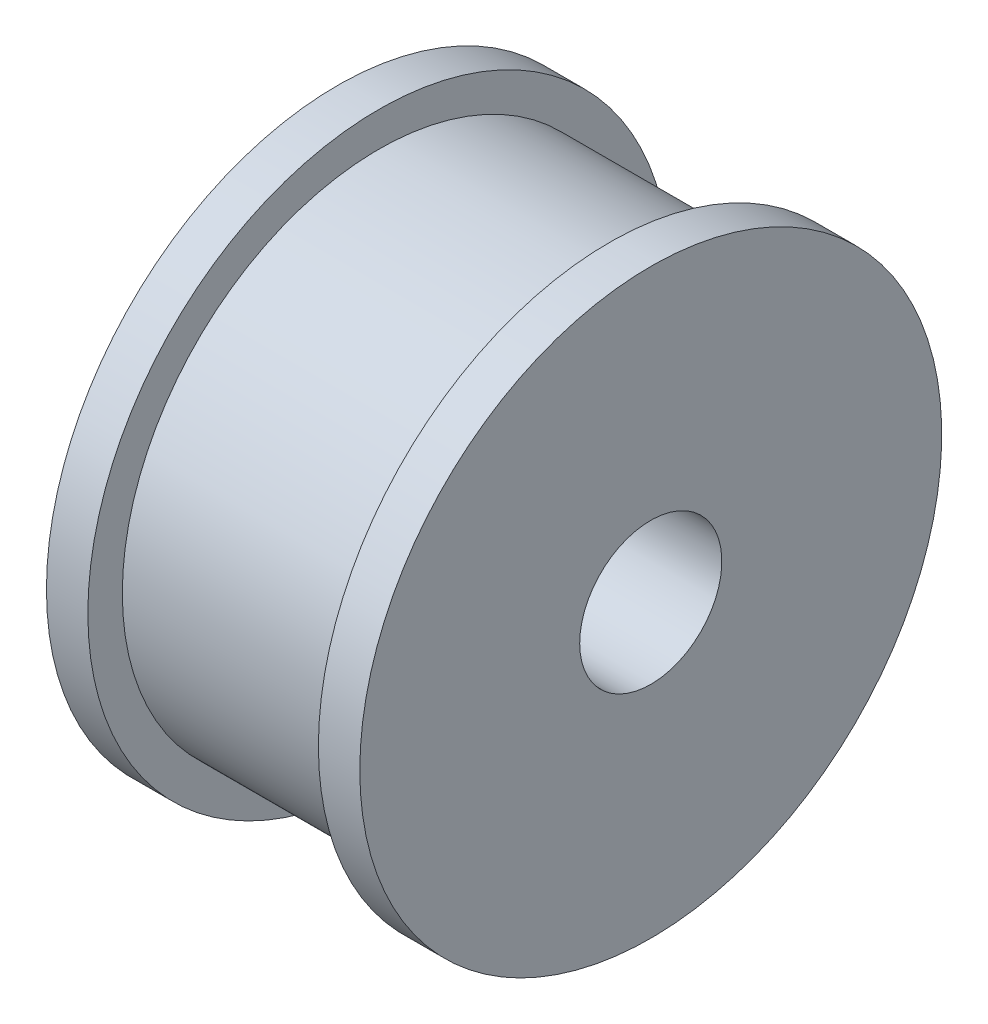
ISO-10303-21;
HEADER;
FILE_DESCRIPTION(('STEP AP214'),'2;1');
FILE_NAME('part.step','',(''),(''),'','','');
FILE_SCHEMA(('AUTOMOTIVE_DESIGN { 1 0 10303 214 1 1 1 1 }'));
ENDSEC;
DATA;
#1=APPLICATION_CONTEXT('core data for automotive mechanical design processes');
#2=APPLICATION_PROTOCOL_DEFINITION('international standard','automotive_design',2000,#1);
#3=PRODUCT_CONTEXT('',#1,'mechanical');
#4=PRODUCT('Part','Part','',(#3));
#5=PRODUCT_RELATED_PRODUCT_CATEGORY('part','',(#4));
#6=PRODUCT_DEFINITION_FORMATION('','',#4);
#7=PRODUCT_DEFINITION_CONTEXT('part definition',#1,'design');
#8=PRODUCT_DEFINITION('design','',#6,#7);
#9=PRODUCT_DEFINITION_SHAPE('','',#8);
#10=(LENGTH_UNIT() NAMED_UNIT(*) SI_UNIT(.MILLI.,.METRE.));
#11=(NAMED_UNIT(*) PLANE_ANGLE_UNIT() SI_UNIT($,.RADIAN.));
#12=(NAMED_UNIT(*) SI_UNIT($,.STERADIAN.) SOLID_ANGLE_UNIT());
#13=UNCERTAINTY_MEASURE_WITH_UNIT(LENGTH_MEASURE(1.E-05),#10,'distance_accuracy_value','');
#14=(GEOMETRIC_REPRESENTATION_CONTEXT(3) GLOBAL_UNCERTAINTY_ASSIGNED_CONTEXT((#13)) GLOBAL_UNIT_ASSIGNED_CONTEXT((#10,
#11,#12)) REPRESENTATION_CONTEXT('',''));
#15=CARTESIAN_POINT('',(0.,0.,0.));
#16=DIRECTION('',(0.,0.,1.));
#17=DIRECTION('',(1.,0.,0.));
#18=AXIS2_PLACEMENT_3D('',#15,#16,#17);
#19=CARTESIAN_POINT('',(-5.15,0.,11.46));
#20=DIRECTION('',(1.,0.,0.));
#21=DIRECTION('',(0.,0.,-1.));
#22=AXIS2_PLACEMENT_3D('',#19,#20,#21);
#23=PLANE('',#22);
#24=CARTESIAN_POINT('',(-5.15,0.,0.));
#25=DIRECTION('',(-1.,0.,0.));
#26=DIRECTION('',(0.,0.,1.));
#27=AXIS2_PLACEMENT_3D('',#24,#25,#26);
#28=CIRCLE('',#27,11.46);
#29=CARTESIAN_POINT('',(-5.15,0.,11.46));
#30=VERTEX_POINT('',#29);
#31=EDGE_CURVE('E53',#30,#30,#28,.T.);
#32=ORIENTED_EDGE('',*,*,#31,.T.);
#33=EDGE_LOOP('',(#32));
#34=FACE_BOUND('',#33,.T.);
#35=CARTESIAN_POINT('',(-5.15,0.,0.));
#36=DIRECTION('',(-1.,0.,0.));
#37=DIRECTION('',(0.,0.,1.));
#38=AXIS2_PLACEMENT_3D('',#35,#36,#37);
#39=CIRCLE('',#38,13.);
#40=CARTESIAN_POINT('',(-5.15,0.,13.));
#41=VERTEX_POINT('',#40);
#42=EDGE_CURVE('E10',#41,#41,#39,.T.);
#43=ORIENTED_EDGE('',*,*,#42,.F.);
#44=EDGE_LOOP('',(#43));
#45=FACE_BOUND('',#44,.T.);
#46=ADVANCED_FACE('F31',(#34,#45),#23,.T.);
#47=CARTESIAN_POINT('',(-7.,0.,0.));
#48=DIRECTION('',(-1.,0.,0.));
#49=DIRECTION('',(0.,0.,1.));
#50=AXIS2_PLACEMENT_3D('',#47,#48,#49);
#51=CYLINDRICAL_SURFACE('',#50,13.);
#52=ORIENTED_EDGE('',*,*,#42,.T.);
#53=EDGE_LOOP('',(#52));
#54=FACE_BOUND('',#53,.T.);
#55=CARTESIAN_POINT('',(-7.,0.,0.));
#56=DIRECTION('',(-1.,0.,0.));
#57=DIRECTION('',(0.,0.,1.));
#58=AXIS2_PLACEMENT_3D('',#55,#56,#57);
#59=CIRCLE('',#58,13.);
#60=CARTESIAN_POINT('',(-7.,0.,13.));
#61=VERTEX_POINT('',#60);
#62=EDGE_CURVE('E37',#61,#61,#59,.T.);
#63=ORIENTED_EDGE('',*,*,#62,.F.);
#64=EDGE_LOOP('',(#63));
#65=FACE_BOUND('',#64,.T.);
#66=ADVANCED_FACE('F68',(#54,#65),#51,.T.);
#67=CARTESIAN_POINT('',(-7.,0.,13.));
#68=DIRECTION('',(-1.,0.,0.));
#69=DIRECTION('',(0.,0.,1.));
#70=AXIS2_PLACEMENT_3D('',#67,#68,#69);
#71=PLANE('',#70);
#72=CARTESIAN_POINT('',(-7.,0.,0.));
#73=DIRECTION('',(-1.,0.,0.));
#74=DIRECTION('',(0.,0.,1.));
#75=AXIS2_PLACEMENT_3D('',#72,#73,#74);
#76=CIRCLE('',#75,3.17499999999999);
#77=CARTESIAN_POINT('',(-7.,0.,3.17499999999999));
#78=VERTEX_POINT('',#77);
#79=EDGE_CURVE('E59',#78,#78,#76,.T.);
#80=ORIENTED_EDGE('',*,*,#79,.F.);
#81=EDGE_LOOP('',(#80));
#82=FACE_BOUND('',#81,.T.);
#83=ORIENTED_EDGE('',*,*,#62,.T.);
#84=EDGE_LOOP('',(#83));
#85=FACE_BOUND('',#84,.T.);
#86=ADVANCED_FACE('F65',(#82,#85),#71,.T.);
#87=CARTESIAN_POINT('',(7.,0.,0.));
#88=DIRECTION('',(1.,0.,0.));
#89=DIRECTION('',(0.,0.,-1.));
#90=AXIS2_PLACEMENT_3D('',#87,#88,#89);
#91=PLANE('',#90);
#92=CARTESIAN_POINT('',(7.,0.,0.));
#93=DIRECTION('',(-1.,0.,0.));
#94=DIRECTION('',(0.,0.,1.));
#95=AXIS2_PLACEMENT_3D('',#92,#93,#94);
#96=CIRCLE('',#95,3.175);
#97=CARTESIAN_POINT('',(7.,0.,3.175));
#98=VERTEX_POINT('',#97);
#99=EDGE_CURVE('E56',#98,#98,#96,.T.);
#100=ORIENTED_EDGE('',*,*,#99,.T.);
#101=EDGE_LOOP('',(#100));
#102=FACE_BOUND('',#101,.T.);
#103=CARTESIAN_POINT('',(7.,0.,0.));
#104=DIRECTION('',(-1.,0.,0.));
#105=DIRECTION('',(0.,0.,1.));
#106=AXIS2_PLACEMENT_3D('',#103,#104,#105);
#107=CIRCLE('',#106,13.);
#108=CARTESIAN_POINT('',(7.,0.,13.));
#109=VERTEX_POINT('',#108);
#110=EDGE_CURVE('E41',#109,#109,#107,.T.);
#111=ORIENTED_EDGE('',*,*,#110,.F.);
#112=EDGE_LOOP('',(#111));
#113=FACE_BOUND('',#112,.T.);
#114=ADVANCED_FACE('F67',(#102,#113),#91,.T.);
#115=CARTESIAN_POINT('',(-7.,0.,0.));
#116=DIRECTION('',(-1.,0.,0.));
#117=DIRECTION('',(0.,0.,1.));
#118=AXIS2_PLACEMENT_3D('',#115,#116,#117);
#119=CYLINDRICAL_SURFACE('',#118,13.);
#120=ORIENTED_EDGE('',*,*,#110,.T.);
#121=EDGE_LOOP('',(#120));
#122=FACE_BOUND('',#121,.T.);
#123=CARTESIAN_POINT('',(5.15,0.,0.));
#124=DIRECTION('',(-1.,0.,0.));
#125=DIRECTION('',(0.,0.,1.));
#126=AXIS2_PLACEMENT_3D('',#123,#124,#125);
#127=CIRCLE('',#126,13.);
#128=CARTESIAN_POINT('',(5.15,0.,13.));
#129=VERTEX_POINT('',#128);
#130=EDGE_CURVE('E45',#129,#129,#127,.T.);
#131=ORIENTED_EDGE('',*,*,#130,.F.);
#132=EDGE_LOOP('',(#131));
#133=FACE_BOUND('',#132,.T.);
#134=ADVANCED_FACE('F74',(#122,#133),#119,.T.);
#135=CARTESIAN_POINT('',(5.15,0.,13.));
#136=DIRECTION('',(-1.,0.,0.));
#137=DIRECTION('',(0.,0.,1.));
#138=AXIS2_PLACEMENT_3D('',#135,#136,#137);
#139=PLANE('',#138);
#140=ORIENTED_EDGE('',*,*,#130,.T.);
#141=EDGE_LOOP('',(#140));
#142=FACE_BOUND('',#141,.T.);
#143=CARTESIAN_POINT('',(5.15,0.,0.));
#144=DIRECTION('',(-1.,0.,0.));
#145=DIRECTION('',(0.,0.,1.));
#146=AXIS2_PLACEMENT_3D('',#143,#144,#145);
#147=CIRCLE('',#146,11.46);
#148=CARTESIAN_POINT('',(5.15,0.,11.46));
#149=VERTEX_POINT('',#148);
#150=EDGE_CURVE('E50',#149,#149,#147,.T.);
#151=ORIENTED_EDGE('',*,*,#150,.F.);
#152=EDGE_LOOP('',(#151));
#153=FACE_BOUND('',#152,.T.);
#154=ADVANCED_FACE('F86',(#142,#153),#139,.T.);
#155=CARTESIAN_POINT('',(-7.,0.,0.));
#156=DIRECTION('',(-1.,0.,0.));
#157=DIRECTION('',(0.,0.,1.));
#158=AXIS2_PLACEMENT_3D('',#155,#156,#157);
#159=CYLINDRICAL_SURFACE('',#158,11.46);
#160=ORIENTED_EDGE('',*,*,#150,.T.);
#161=EDGE_LOOP('',(#160));
#162=FACE_BOUND('',#161,.T.);
#163=ORIENTED_EDGE('',*,*,#31,.F.);
#164=EDGE_LOOP('',(#163));
#165=FACE_BOUND('',#164,.T.);
#166=ADVANCED_FACE('F84',(#162,#165),#159,.T.);
#167=CARTESIAN_POINT('',(-7.,0.,0.));
#168=DIRECTION('',(-1.,0.,0.));
#169=DIRECTION('',(0.,0.,1.));
#170=AXIS2_PLACEMENT_3D('',#167,#168,#169);
#171=CYLINDRICAL_SURFACE('',#170,3.17499999999999);
#172=ORIENTED_EDGE('',*,*,#99,.F.);
#173=EDGE_LOOP('',(#172));
#174=FACE_BOUND('',#173,.T.);
#175=ORIENTED_EDGE('',*,*,#79,.T.);
#176=EDGE_LOOP('',(#175));
#177=FACE_BOUND('',#176,.T.);
#178=ADVANCED_FACE('F63',(#174,#177),#171,.F.);
#179=CLOSED_SHELL('',(#46,#66,#86,#114,#134,#154,#166,#178));
#180=MANIFOLD_SOLID_BREP('B2',#179);
#181=ADVANCED_BREP_SHAPE_REPRESENTATION('',(#18,#180),#14);
#182=SHAPE_DEFINITION_REPRESENTATION(#9,#181);
ENDSEC;
END-ISO-10303-21;
